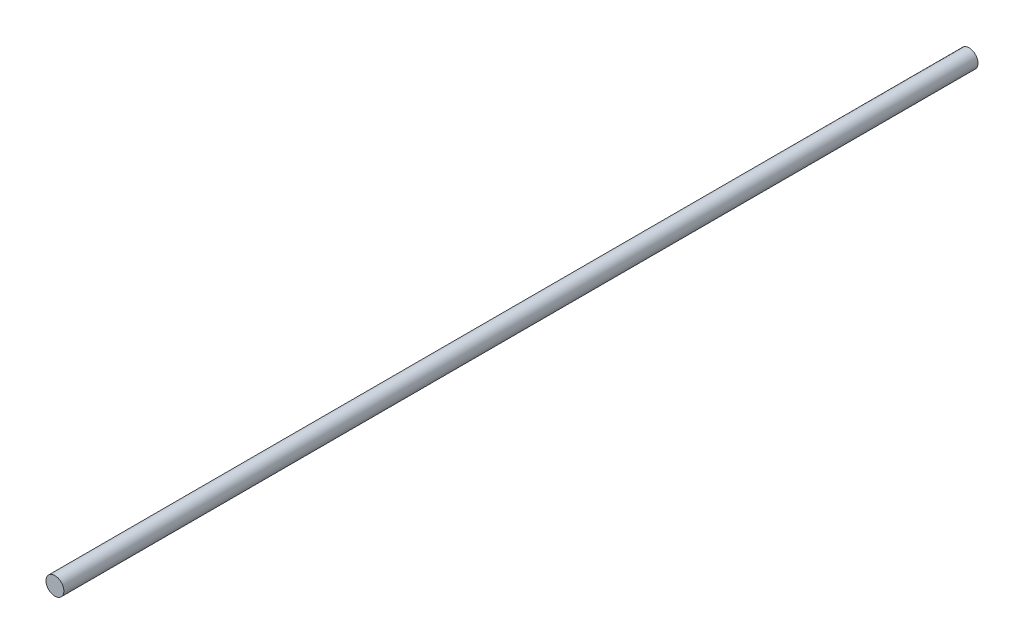
ISO-10303-21;
HEADER;
FILE_DESCRIPTION(('STEP AP214'),'2;1');
FILE_NAME('part.step','',(''),(''),'','','');
FILE_SCHEMA(('AUTOMOTIVE_DESIGN { 1 0 10303 214 1 1 1 1 }'));
ENDSEC;
DATA;
#1=APPLICATION_CONTEXT('core data for automotive mechanical design processes');
#2=APPLICATION_PROTOCOL_DEFINITION('international standard','automotive_design',2000,#1);
#3=PRODUCT_CONTEXT('',#1,'mechanical');
#4=PRODUCT('Part','Part','',(#3));
#5=PRODUCT_RELATED_PRODUCT_CATEGORY('part','',(#4));
#6=PRODUCT_DEFINITION_FORMATION('','',#4);
#7=PRODUCT_DEFINITION_CONTEXT('part definition',#1,'design');
#8=PRODUCT_DEFINITION('design','',#6,#7);
#9=PRODUCT_DEFINITION_SHAPE('','',#8);
#10=(LENGTH_UNIT() NAMED_UNIT(*) SI_UNIT(.MILLI.,.METRE.));
#11=(NAMED_UNIT(*) PLANE_ANGLE_UNIT() SI_UNIT($,.RADIAN.));
#12=(NAMED_UNIT(*) SI_UNIT($,.STERADIAN.) SOLID_ANGLE_UNIT());
#13=UNCERTAINTY_MEASURE_WITH_UNIT(LENGTH_MEASURE(1.E-05),#10,'distance_accuracy_value','');
#14=(GEOMETRIC_REPRESENTATION_CONTEXT(3) GLOBAL_UNCERTAINTY_ASSIGNED_CONTEXT((#13)) GLOBAL_UNIT_ASSIGNED_CONTEXT((#10,
#11,#12)) REPRESENTATION_CONTEXT('',''));
#15=CARTESIAN_POINT('',(0.,0.,0.));
#16=DIRECTION('',(0.,0.,1.));
#17=DIRECTION('',(1.,0.,0.));
#18=AXIS2_PLACEMENT_3D('',#15,#16,#17);
#19=CARTESIAN_POINT('',(0.,0.,1000.));
#20=DIRECTION('',(0.,0.,-1.));
#21=DIRECTION('',(-1.,0.,0.));
#22=AXIS2_PLACEMENT_3D('',#19,#20,#21);
#23=CYLINDRICAL_SURFACE('',#22,9.779);
#24=CARTESIAN_POINT('',(0.,0.,1000.));
#25=DIRECTION('',(0.,0.,1.));
#26=DIRECTION('',(1.,0.,0.));
#27=AXIS2_PLACEMENT_3D('',#24,#25,#26);
#28=CIRCLE('',#27,9.779);
#29=CARTESIAN_POINT('',(9.779,0.,1000.));
#30=VERTEX_POINT('',#29);
#31=EDGE_CURVE('E10',#30,#30,#28,.T.);
#32=ORIENTED_EDGE('',*,*,#31,.F.);
#33=EDGE_LOOP('',(#32));
#34=FACE_BOUND('',#33,.T.);
#35=CARTESIAN_POINT('',(0.,0.,0.));
#36=DIRECTION('',(0.,0.,1.));
#37=DIRECTION('',(1.,0.,0.));
#38=AXIS2_PLACEMENT_3D('',#35,#36,#37);
#39=CIRCLE('',#38,9.779);
#40=CARTESIAN_POINT('',(9.779,0.,0.));
#41=VERTEX_POINT('',#40);
#42=EDGE_CURVE('E34',#41,#41,#39,.T.);
#43=ORIENTED_EDGE('',*,*,#42,.T.);
#44=EDGE_LOOP('',(#43));
#45=FACE_BOUND('',#44,.T.);
#46=ADVANCED_FACE('F31',(#34,#45),#23,.T.);
#47=CARTESIAN_POINT('',(0.,0.,1000.));
#48=DIRECTION('',(0.,0.,1.));
#49=DIRECTION('',(1.,0.,0.));
#50=AXIS2_PLACEMENT_3D('',#47,#48,#49);
#51=PLANE('',#50);
#52=ORIENTED_EDGE('',*,*,#31,.T.);
#53=EDGE_LOOP('',(#52));
#54=FACE_BOUND('',#53,.T.);
#55=ADVANCED_FACE('F46',(#54),#51,.T.);
#56=CARTESIAN_POINT('',(0.,0.,0.));
#57=DIRECTION('',(0.,0.,1.));
#58=DIRECTION('',(1.,0.,0.));
#59=AXIS2_PLACEMENT_3D('',#56,#57,#58);
#60=PLANE('',#59);
#61=ORIENTED_EDGE('',*,*,#42,.F.);
#62=EDGE_LOOP('',(#61));
#63=FACE_BOUND('',#62,.T.);
#64=ADVANCED_FACE('F44',(#63),#60,.F.);
#65=CLOSED_SHELL('',(#46,#55,#64));
#66=MANIFOLD_SOLID_BREP('B2',#65);
#67=ADVANCED_BREP_SHAPE_REPRESENTATION('',(#18,#66),#14);
#68=SHAPE_DEFINITION_REPRESENTATION(#9,#67);
ENDSEC;
END-ISO-10303-21;
